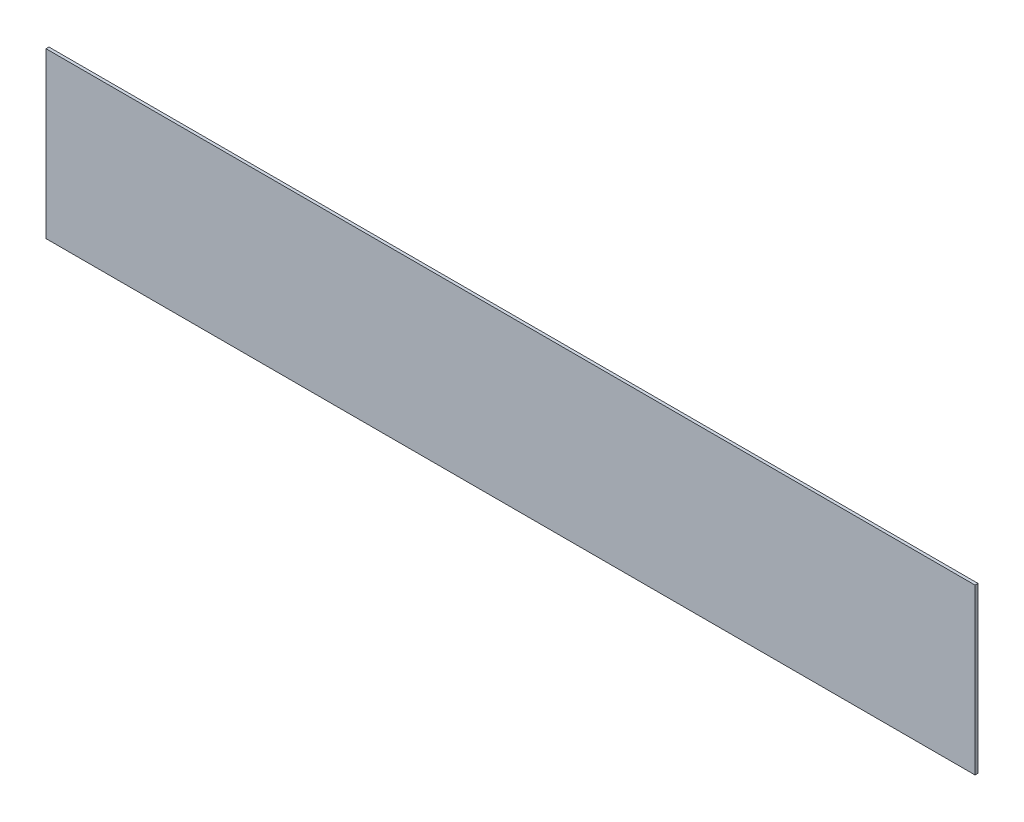
ISO-10303-21;
HEADER;
FILE_DESCRIPTION(('STEP AP214'),'2;1');
FILE_NAME('part.step','',(''),(''),'','','');
FILE_SCHEMA(('AUTOMOTIVE_DESIGN { 1 0 10303 214 1 1 1 1 }'));
ENDSEC;
DATA;
#1=APPLICATION_CONTEXT('core data for automotive mechanical design processes');
#2=APPLICATION_PROTOCOL_DEFINITION('international standard','automotive_design',2000,#1);
#3=PRODUCT_CONTEXT('',#1,'mechanical');
#4=PRODUCT('Part','Part','',(#3));
#5=PRODUCT_RELATED_PRODUCT_CATEGORY('part','',(#4));
#6=PRODUCT_DEFINITION_FORMATION('','',#4);
#7=PRODUCT_DEFINITION_CONTEXT('part definition',#1,'design');
#8=PRODUCT_DEFINITION('design','',#6,#7);
#9=PRODUCT_DEFINITION_SHAPE('','',#8);
#10=(LENGTH_UNIT() NAMED_UNIT(*) SI_UNIT(.MILLI.,.METRE.));
#11=(NAMED_UNIT(*) PLANE_ANGLE_UNIT() SI_UNIT($,.RADIAN.));
#12=(NAMED_UNIT(*) SI_UNIT($,.STERADIAN.) SOLID_ANGLE_UNIT());
#13=UNCERTAINTY_MEASURE_WITH_UNIT(LENGTH_MEASURE(1.E-05),#10,'distance_accuracy_value','');
#14=(GEOMETRIC_REPRESENTATION_CONTEXT(3) GLOBAL_UNCERTAINTY_ASSIGNED_CONTEXT((#13)) GLOBAL_UNIT_ASSIGNED_CONTEXT((#10,
#11,#12)) REPRESENTATION_CONTEXT('',''));
#15=CARTESIAN_POINT('',(0.,0.,0.));
#16=DIRECTION('',(0.,0.,1.));
#17=DIRECTION('',(1.,0.,0.));
#18=AXIS2_PLACEMENT_3D('',#15,#16,#17);
#19=CARTESIAN_POINT('',(0.,0.,3.175));
#20=DIRECTION('',(1.,0.,0.));
#21=DIRECTION('',(0.,1.,0.));
#22=AXIS2_PLACEMENT_3D('',#19,#20,#21);
#23=PLANE('',#22);
#24=DIRECTION('',(0.,-1.,0.));
#25=VECTOR('',#24,1.);
#26=CARTESIAN_POINT('',(0.,0.,0.));
#27=LINE('',#26,#25);
#28=CARTESIAN_POINT('',(0.,0.,0.));
#29=VERTEX_POINT('',#28);
#30=CARTESIAN_POINT('',(0.,-177.038,0.));
#31=VERTEX_POINT('',#30);
#32=EDGE_CURVE('E96',#29,#31,#27,.T.);
#33=ORIENTED_EDGE('',*,*,#32,.T.);
#34=DIRECTION('',(0.,0.,-1.));
#35=VECTOR('',#34,1.);
#36=CARTESIAN_POINT('',(0.,-177.038,3.175));
#37=LINE('',#36,#35);
#38=CARTESIAN_POINT('',(0.,-177.038,3.175));
#39=VERTEX_POINT('',#38);
#40=EDGE_CURVE('E11',#39,#31,#37,.T.);
#41=ORIENTED_EDGE('',*,*,#40,.F.);
#42=DIRECTION('',(0.,-1.,0.));
#43=VECTOR('',#42,1.);
#44=CARTESIAN_POINT('',(0.,0.,3.175));
#45=LINE('',#44,#43);
#46=CARTESIAN_POINT('',(0.,0.,3.175));
#47=VERTEX_POINT('',#46);
#48=EDGE_CURVE('E84',#47,#39,#45,.T.);
#49=ORIENTED_EDGE('',*,*,#48,.F.);
#50=DIRECTION('',(0.,0.,-1.));
#51=VECTOR('',#50,1.);
#52=CARTESIAN_POINT('',(0.,0.,3.175));
#53=LINE('',#52,#51);
#54=EDGE_CURVE('E92',#47,#29,#53,.T.);
#55=ORIENTED_EDGE('',*,*,#54,.T.);
#56=EDGE_LOOP('',(#33,#41,#49,#55));
#57=FACE_BOUND('',#56,.T.);
#58=ADVANCED_FACE('F33',(#57),#23,.F.);
#59=CARTESIAN_POINT('',(0.,-177.038,3.175));
#60=DIRECTION('',(0.,1.,0.));
#61=DIRECTION('',(0.,0.,1.));
#62=AXIS2_PLACEMENT_3D('',#59,#60,#61);
#63=PLANE('',#62);
#64=DIRECTION('',(1.,0.,0.));
#65=VECTOR('',#64,1.);
#66=CARTESIAN_POINT('',(0.,-177.038,0.));
#67=LINE('',#66,#65);
#68=CARTESIAN_POINT('',(1000.,-177.038,0.));
#69=VERTEX_POINT('',#68);
#70=EDGE_CURVE('E88',#31,#69,#67,.T.);
#71=ORIENTED_EDGE('',*,*,#70,.T.);
#72=DIRECTION('',(0.,0.,-1.));
#73=VECTOR('',#72,1.);
#74=CARTESIAN_POINT('',(1000.,-177.038,3.175));
#75=LINE('',#74,#73);
#76=CARTESIAN_POINT('',(1000.,-177.038,3.175));
#77=VERTEX_POINT('',#76);
#78=EDGE_CURVE('E41',#77,#69,#75,.T.);
#79=ORIENTED_EDGE('',*,*,#78,.F.);
#80=DIRECTION('',(1.,0.,0.));
#81=VECTOR('',#80,1.);
#82=CARTESIAN_POINT('',(0.,-177.038,3.175));
#83=LINE('',#82,#81);
#84=EDGE_CURVE('E79',#39,#77,#83,.T.);
#85=ORIENTED_EDGE('',*,*,#84,.F.);
#86=ORIENTED_EDGE('',*,*,#40,.T.);
#87=EDGE_LOOP('',(#71,#79,#85,#86));
#88=FACE_BOUND('',#87,.T.);
#89=ADVANCED_FACE('F87',(#88),#63,.F.);
#90=CARTESIAN_POINT('',(1000.,0.,3.175));
#91=DIRECTION('',(-1.,0.,0.));
#92=DIRECTION('',(0.,-1.,0.));
#93=AXIS2_PLACEMENT_3D('',#90,#91,#92);
#94=PLANE('',#93);
#95=DIRECTION('',(0.,1.,0.));
#96=VECTOR('',#95,1.);
#97=CARTESIAN_POINT('',(1000.,0.,0.));
#98=LINE('',#97,#96);
#99=CARTESIAN_POINT('',(1000.,0.,0.));
#100=VERTEX_POINT('',#99);
#101=EDGE_CURVE('E66',#69,#100,#98,.T.);
#102=ORIENTED_EDGE('',*,*,#101,.T.);
#103=DIRECTION('',(0.,0.,-1.));
#104=VECTOR('',#103,1.);
#105=CARTESIAN_POINT('',(1000.,0.,3.175));
#106=LINE('',#105,#104);
#107=CARTESIAN_POINT('',(1000.,0.,3.175));
#108=VERTEX_POINT('',#107);
#109=EDGE_CURVE('E89',#108,#100,#106,.T.);
#110=ORIENTED_EDGE('',*,*,#109,.F.);
#111=DIRECTION('',(0.,1.,0.));
#112=VECTOR('',#111,1.);
#113=CARTESIAN_POINT('',(1000.,0.,3.175));
#114=LINE('',#113,#112);
#115=EDGE_CURVE('E82',#77,#108,#114,.T.);
#116=ORIENTED_EDGE('',*,*,#115,.F.);
#117=ORIENTED_EDGE('',*,*,#78,.T.);
#118=EDGE_LOOP('',(#102,#110,#116,#117));
#119=FACE_BOUND('',#118,.T.);
#120=ADVANCED_FACE('F90',(#119),#94,.F.);
#121=CARTESIAN_POINT('',(0.,0.,3.175));
#122=DIRECTION('',(0.,-1.,0.));
#123=DIRECTION('',(0.,0.,-1.));
#124=AXIS2_PLACEMENT_3D('',#121,#122,#123);
#125=PLANE('',#124);
#126=DIRECTION('',(-1.,0.,0.));
#127=VECTOR('',#126,1.);
#128=CARTESIAN_POINT('',(0.,0.,0.));
#129=LINE('',#128,#127);
#130=EDGE_CURVE('E72',#100,#29,#129,.T.);
#131=ORIENTED_EDGE('',*,*,#130,.T.);
#132=ORIENTED_EDGE('',*,*,#54,.F.);
#133=DIRECTION('',(-1.,0.,0.));
#134=VECTOR('',#133,1.);
#135=CARTESIAN_POINT('',(0.,0.,3.175));
#136=LINE('',#135,#134);
#137=EDGE_CURVE('E49',#108,#47,#136,.T.);
#138=ORIENTED_EDGE('',*,*,#137,.F.);
#139=ORIENTED_EDGE('',*,*,#109,.T.);
#140=EDGE_LOOP('',(#131,#132,#138,#139));
#141=FACE_BOUND('',#140,.T.);
#142=ADVANCED_FACE('F103',(#141),#125,.F.);
#143=CARTESIAN_POINT('',(0.,0.,3.175));
#144=DIRECTION('',(0.,0.,1.));
#145=DIRECTION('',(1.,0.,0.));
#146=AXIS2_PLACEMENT_3D('',#143,#144,#145);
#147=PLANE('',#146);
#148=ORIENTED_EDGE('',*,*,#48,.T.);
#149=ORIENTED_EDGE('',*,*,#84,.T.);
#150=ORIENTED_EDGE('',*,*,#115,.T.);
#151=ORIENTED_EDGE('',*,*,#137,.T.);
#152=EDGE_LOOP('',(#148,#149,#150,#151));
#153=FACE_BOUND('',#152,.T.);
#154=ADVANCED_FACE('F80',(#153),#147,.T.);
#155=CARTESIAN_POINT('',(0.,0.,0.));
#156=DIRECTION('',(0.,0.,1.));
#157=DIRECTION('',(1.,0.,0.));
#158=AXIS2_PLACEMENT_3D('',#155,#156,#157);
#159=PLANE('',#158);
#160=ORIENTED_EDGE('',*,*,#32,.F.);
#161=ORIENTED_EDGE('',*,*,#130,.F.);
#162=ORIENTED_EDGE('',*,*,#101,.F.);
#163=ORIENTED_EDGE('',*,*,#70,.F.);
#164=EDGE_LOOP('',(#160,#161,#162,#163));
#165=FACE_BOUND('',#164,.T.);
#166=ADVANCED_FACE('F106',(#165),#159,.F.);
#167=CLOSED_SHELL('',(#58,#89,#120,#142,#154,#166));
#168=MANIFOLD_SOLID_BREP('B2',#167);
#169=ADVANCED_BREP_SHAPE_REPRESENTATION('',(#18,#168),#14);
#170=SHAPE_DEFINITION_REPRESENTATION(#9,#169);
ENDSEC;
END-ISO-10303-21;
